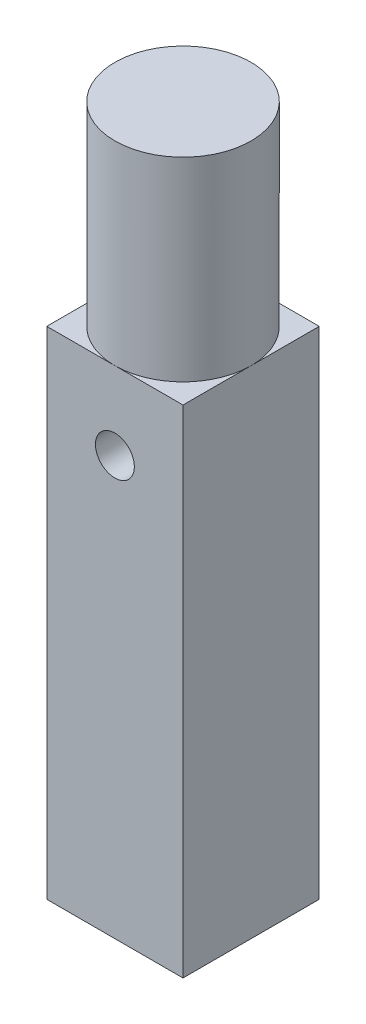
ISO-10303-21;
HEADER;
FILE_DESCRIPTION(('STEP AP214'),'2;1');
FILE_NAME('part.step','',(''),(''),'','','');
FILE_SCHEMA(('AUTOMOTIVE_DESIGN { 1 0 10303 214 1 1 1 1 }'));
ENDSEC;
DATA;
#1=APPLICATION_CONTEXT('core data for automotive mechanical design processes');
#2=APPLICATION_PROTOCOL_DEFINITION('international standard','automotive_design',2000,#1);
#3=PRODUCT_CONTEXT('',#1,'mechanical');
#4=PRODUCT('Part','Part','',(#3));
#5=PRODUCT_RELATED_PRODUCT_CATEGORY('part','',(#4));
#6=PRODUCT_DEFINITION_FORMATION('','',#4);
#7=PRODUCT_DEFINITION_CONTEXT('part definition',#1,'design');
#8=PRODUCT_DEFINITION('design','',#6,#7);
#9=PRODUCT_DEFINITION_SHAPE('','',#8);
#10=(LENGTH_UNIT() NAMED_UNIT(*) SI_UNIT(.MILLI.,.METRE.));
#11=(NAMED_UNIT(*) PLANE_ANGLE_UNIT() SI_UNIT($,.RADIAN.));
#12=(NAMED_UNIT(*) SI_UNIT($,.STERADIAN.) SOLID_ANGLE_UNIT());
#13=UNCERTAINTY_MEASURE_WITH_UNIT(LENGTH_MEASURE(1.E-05),#10,'distance_accuracy_value','');
#14=(GEOMETRIC_REPRESENTATION_CONTEXT(3) GLOBAL_UNCERTAINTY_ASSIGNED_CONTEXT((#13)) GLOBAL_UNIT_ASSIGNED_CONTEXT((#10,
#11,#12)) REPRESENTATION_CONTEXT('',''));
#15=CARTESIAN_POINT('',(0.,0.,0.));
#16=DIRECTION('',(0.,0.,1.));
#17=DIRECTION('',(1.,0.,0.));
#18=AXIS2_PLACEMENT_3D('',#15,#16,#17);
#19=CARTESIAN_POINT('',(0.,450.85,0.));
#20=DIRECTION('',(0.,1.,0.));
#21=DIRECTION('',(0.,0.,1.));
#22=AXIS2_PLACEMENT_3D('',#19,#20,#21);
#23=PLANE('',#22);
#24=CARTESIAN_POINT('',(0.,450.85,0.));
#25=DIRECTION('',(0.,1.,0.));
#26=DIRECTION('',(0.,0.,1.));
#27=AXIS2_PLACEMENT_3D('',#24,#25,#26);
#28=CIRCLE('',#27,44.45);
#29=CARTESIAN_POINT('',(0.,450.85,44.45));
#30=VERTEX_POINT('',#29);
#31=EDGE_CURVE('E187',#30,#30,#28,.T.);
#32=ORIENTED_EDGE('',*,*,#31,.T.);
#33=EDGE_LOOP('',(#32));
#34=FACE_BOUND('',#33,.T.);
#35=ADVANCED_FACE('F71',(#34),#23,.T.);
#36=CARTESIAN_POINT('',(-44.45,450.85,44.45));
#37=DIRECTION('',(0.,0.,-1.));
#38=DIRECTION('',(-1.,0.,0.));
#39=AXIS2_PLACEMENT_3D('',#36,#37,#38);
#40=PLANE('',#39);
#41=CARTESIAN_POINT('',(0.,273.05,44.45));
#42=DIRECTION('',(0.,0.,1.));
#43=DIRECTION('',(1.,0.,0.));
#44=AXIS2_PLACEMENT_3D('',#41,#42,#43);
#45=CIRCLE('',#44,12.7);
#46=CARTESIAN_POINT('',(12.7,273.05,44.45));
#47=VERTEX_POINT('',#46);
#48=EDGE_CURVE('E202',#47,#47,#45,.T.);
#49=ORIENTED_EDGE('',*,*,#48,.F.);
#50=EDGE_LOOP('',(#49));
#51=FACE_BOUND('',#50,.T.);
#52=DIRECTION('',(1.,0.,0.));
#53=VECTOR('',#52,1.);
#54=CARTESIAN_POINT('',(0.,323.85,44.45));
#55=LINE('',#54,#53);
#56=CARTESIAN_POINT('',(0.,323.85,44.45));
#57=VERTEX_POINT('',#56);
#58=CARTESIAN_POINT('',(44.45,323.85,44.45));
#59=VERTEX_POINT('',#58);
#60=EDGE_CURVE('E128',#57,#59,#55,.T.);
#61=ORIENTED_EDGE('',*,*,#60,.F.);
#62=DIRECTION('',(1.,0.,0.));
#63=VECTOR('',#62,1.);
#64=CARTESIAN_POINT('',(0.,323.85,44.45));
#65=LINE('',#64,#63);
#66=CARTESIAN_POINT('',(-44.45,323.85,44.45));
#67=VERTEX_POINT('',#66);
#68=EDGE_CURVE('E138',#67,#57,#65,.T.);
#69=ORIENTED_EDGE('',*,*,#68,.F.);
#70=DIRECTION('',(0.,-1.,0.));
#71=VECTOR('',#70,1.);
#72=CARTESIAN_POINT('',(-44.45,450.85,44.45));
#73=LINE('',#72,#71);
#74=CARTESIAN_POINT('',(-44.45,0.,44.45));
#75=VERTEX_POINT('',#74);
#76=EDGE_CURVE('E93',#67,#75,#73,.T.);
#77=ORIENTED_EDGE('',*,*,#76,.T.);
#78=DIRECTION('',(1.,0.,0.));
#79=VECTOR('',#78,1.);
#80=CARTESIAN_POINT('',(-44.45,0.,44.45));
#81=LINE('',#80,#79);
#82=CARTESIAN_POINT('',(44.45,0.,44.45));
#83=VERTEX_POINT('',#82);
#84=EDGE_CURVE('E161',#75,#83,#81,.T.);
#85=ORIENTED_EDGE('',*,*,#84,.T.);
#86=DIRECTION('',(0.,-1.,0.));
#87=VECTOR('',#86,1.);
#88=CARTESIAN_POINT('',(44.45,450.85,44.45));
#89=LINE('',#88,#87);
#90=EDGE_CURVE('E86',#59,#83,#89,.T.);
#91=ORIENTED_EDGE('',*,*,#90,.F.);
#92=EDGE_LOOP('',(#61,#69,#77,#85,#91));
#93=FACE_BOUND('',#92,.T.);
#94=ADVANCED_FACE('F136',(#51,#93),#40,.F.);
#95=CARTESIAN_POINT('',(44.45,450.85,-44.45));
#96=DIRECTION('',(-1.,0.,0.));
#97=DIRECTION('',(0.,0.,1.));
#98=AXIS2_PLACEMENT_3D('',#95,#96,#97);
#99=PLANE('',#98);
#100=DIRECTION('',(0.,0.,-1.));
#101=VECTOR('',#100,1.);
#102=CARTESIAN_POINT('',(44.45,323.85,0.));
#103=LINE('',#102,#101);
#104=CARTESIAN_POINT('',(44.45,323.85,0.));
#105=VERTEX_POINT('',#104);
#106=EDGE_CURVE('E129',#59,#105,#103,.T.);
#107=ORIENTED_EDGE('',*,*,#106,.F.);
#108=ORIENTED_EDGE('',*,*,#90,.T.);
#109=DIRECTION('',(0.,0.,-1.));
#110=VECTOR('',#109,1.);
#111=CARTESIAN_POINT('',(44.45,0.,-44.45));
#112=LINE('',#111,#110);
#113=CARTESIAN_POINT('',(44.45,0.,-44.45));
#114=VERTEX_POINT('',#113);
#115=EDGE_CURVE('E151',#83,#114,#112,.T.);
#116=ORIENTED_EDGE('',*,*,#115,.T.);
#117=DIRECTION('',(0.,-1.,0.));
#118=VECTOR('',#117,1.);
#119=CARTESIAN_POINT('',(44.45,450.85,-44.45));
#120=LINE('',#119,#118);
#121=CARTESIAN_POINT('',(44.45,323.85,-44.45));
#122=VERTEX_POINT('',#121);
#123=EDGE_CURVE('E12',#122,#114,#120,.T.);
#124=ORIENTED_EDGE('',*,*,#123,.F.);
#125=DIRECTION('',(0.,0.,-1.));
#126=VECTOR('',#125,1.);
#127=CARTESIAN_POINT('',(44.45,323.85,0.));
#128=LINE('',#127,#126);
#129=EDGE_CURVE('E181',#105,#122,#128,.T.);
#130=ORIENTED_EDGE('',*,*,#129,.F.);
#131=EDGE_LOOP('',(#107,#108,#116,#124,#130));
#132=FACE_BOUND('',#131,.T.);
#133=ADVANCED_FACE('F73',(#132),#99,.F.);
#134=CARTESIAN_POINT('',(-44.45,450.85,-44.45));
#135=DIRECTION('',(0.,0.,1.));
#136=DIRECTION('',(1.,0.,0.));
#137=AXIS2_PLACEMENT_3D('',#134,#135,#136);
#138=PLANE('',#137);
#139=CARTESIAN_POINT('',(0.,273.05,-44.45));
#140=DIRECTION('',(0.,0.,1.));
#141=DIRECTION('',(1.,0.,0.));
#142=AXIS2_PLACEMENT_3D('',#139,#140,#141);
#143=CIRCLE('',#142,12.7);
#144=CARTESIAN_POINT('',(12.7,273.05,-44.45));
#145=VERTEX_POINT('',#144);
#146=EDGE_CURVE('E134',#145,#145,#143,.T.);
#147=ORIENTED_EDGE('',*,*,#146,.T.);
#148=EDGE_LOOP('',(#147));
#149=FACE_BOUND('',#148,.T.);
#150=DIRECTION('',(-1.,0.,0.));
#151=VECTOR('',#150,1.);
#152=CARTESIAN_POINT('',(0.,323.85,-44.45));
#153=LINE('',#152,#151);
#154=CARTESIAN_POINT('',(0.,323.85,-44.45));
#155=VERTEX_POINT('',#154);
#156=CARTESIAN_POINT('',(-44.45,323.85,-44.45));
#157=VERTEX_POINT('',#156);
#158=EDGE_CURVE('E194',#155,#157,#153,.T.);
#159=ORIENTED_EDGE('',*,*,#158,.F.);
#160=DIRECTION('',(-1.,0.,0.));
#161=VECTOR('',#160,1.);
#162=CARTESIAN_POINT('',(0.,323.85,-44.45));
#163=LINE('',#162,#161);
#164=EDGE_CURVE('E148',#122,#155,#163,.T.);
#165=ORIENTED_EDGE('',*,*,#164,.F.);
#166=ORIENTED_EDGE('',*,*,#123,.T.);
#167=DIRECTION('',(-1.,0.,0.));
#168=VECTOR('',#167,1.);
#169=CARTESIAN_POINT('',(-44.45,0.,-44.45));
#170=LINE('',#169,#168);
#171=CARTESIAN_POINT('',(-44.45,0.,-44.45));
#172=VERTEX_POINT('',#171);
#173=EDGE_CURVE('E153',#114,#172,#170,.T.);
#174=ORIENTED_EDGE('',*,*,#173,.T.);
#175=DIRECTION('',(0.,-1.,0.));
#176=VECTOR('',#175,1.);
#177=CARTESIAN_POINT('',(-44.45,450.85,-44.45));
#178=LINE('',#177,#176);
#179=EDGE_CURVE('E79',#157,#172,#178,.T.);
#180=ORIENTED_EDGE('',*,*,#179,.F.);
#181=EDGE_LOOP('',(#159,#165,#166,#174,#180));
#182=FACE_BOUND('',#181,.T.);
#183=ADVANCED_FACE('F174',(#149,#182),#138,.F.);
#184=CARTESIAN_POINT('',(-44.45,450.85,-44.45));
#185=DIRECTION('',(1.,0.,0.));
#186=DIRECTION('',(0.,0.,-1.));
#187=AXIS2_PLACEMENT_3D('',#184,#185,#186);
#188=PLANE('',#187);
#189=DIRECTION('',(0.,0.,1.));
#190=VECTOR('',#189,1.);
#191=CARTESIAN_POINT('',(-44.45,323.85,0.));
#192=LINE('',#191,#190);
#193=CARTESIAN_POINT('',(-44.45,323.85,0.));
#194=VERTEX_POINT('',#193);
#195=EDGE_CURVE('E170',#157,#194,#192,.T.);
#196=ORIENTED_EDGE('',*,*,#195,.F.);
#197=ORIENTED_EDGE('',*,*,#179,.T.);
#198=DIRECTION('',(0.,0.,1.));
#199=VECTOR('',#198,1.);
#200=CARTESIAN_POINT('',(-44.45,0.,-44.45));
#201=LINE('',#200,#199);
#202=EDGE_CURVE('E159',#172,#75,#201,.T.);
#203=ORIENTED_EDGE('',*,*,#202,.T.);
#204=ORIENTED_EDGE('',*,*,#76,.F.);
#205=DIRECTION('',(0.,0.,1.));
#206=VECTOR('',#205,1.);
#207=CARTESIAN_POINT('',(-44.45,323.85,0.));
#208=LINE('',#207,#206);
#209=EDGE_CURVE('E147',#194,#67,#208,.T.);
#210=ORIENTED_EDGE('',*,*,#209,.F.);
#211=EDGE_LOOP('',(#196,#197,#203,#204,#210));
#212=FACE_BOUND('',#211,.T.);
#213=ADVANCED_FACE('F167',(#212),#188,.F.);
#214=CARTESIAN_POINT('',(0.,0.,0.));
#215=DIRECTION('',(0.,1.,0.));
#216=DIRECTION('',(0.,0.,1.));
#217=AXIS2_PLACEMENT_3D('',#214,#215,#216);
#218=PLANE('',#217);
#219=ORIENTED_EDGE('',*,*,#115,.F.);
#220=ORIENTED_EDGE('',*,*,#84,.F.);
#221=ORIENTED_EDGE('',*,*,#202,.F.);
#222=ORIENTED_EDGE('',*,*,#173,.F.);
#223=EDGE_LOOP('',(#219,#220,#221,#222));
#224=FACE_BOUND('',#223,.T.);
#225=ADVANCED_FACE('F179',(#224),#218,.F.);
#226=CARTESIAN_POINT('',(0.,323.85,0.));
#227=DIRECTION('',(0.,1.,0.));
#228=DIRECTION('',(0.,0.,1.));
#229=AXIS2_PLACEMENT_3D('',#226,#227,#228);
#230=PLANE('',#229);
#231=CARTESIAN_POINT('',(0.,323.85,0.));
#232=DIRECTION('',(0.,1.,0.));
#233=DIRECTION('',(0.,0.,1.));
#234=AXIS2_PLACEMENT_3D('',#231,#232,#233);
#235=CIRCLE('',#234,44.45);
#236=EDGE_CURVE('E141',#194,#57,#235,.T.);
#237=ORIENTED_EDGE('',*,*,#236,.F.);
#238=ORIENTED_EDGE('',*,*,#209,.T.);
#239=ORIENTED_EDGE('',*,*,#68,.T.);
#240=EDGE_LOOP('',(#237,#238,#239));
#241=FACE_BOUND('',#240,.T.);
#242=ADVANCED_FACE('F150',(#241),#230,.T.);
#243=CARTESIAN_POINT('',(0.,323.85,0.));
#244=DIRECTION('',(0.,1.,0.));
#245=DIRECTION('',(0.,0.,1.));
#246=AXIS2_PLACEMENT_3D('',#243,#244,#245);
#247=CYLINDRICAL_SURFACE('',#246,44.45);
#248=ORIENTED_EDGE('',*,*,#31,.F.);
#249=EDGE_LOOP('',(#248));
#250=FACE_BOUND('',#249,.T.);
#251=CARTESIAN_POINT('',(0.,323.85,0.));
#252=DIRECTION('',(0.,1.,0.));
#253=DIRECTION('',(0.,0.,1.));
#254=AXIS2_PLACEMENT_3D('',#251,#252,#253);
#255=CIRCLE('',#254,44.45);
#256=EDGE_CURVE('E125',#57,#105,#255,.T.);
#257=ORIENTED_EDGE('',*,*,#256,.T.);
#258=CARTESIAN_POINT('',(0.,323.85,0.));
#259=DIRECTION('',(0.,1.,0.));
#260=DIRECTION('',(0.,0.,1.));
#261=AXIS2_PLACEMENT_3D('',#258,#259,#260);
#262=CIRCLE('',#261,44.45);
#263=EDGE_CURVE('E184',#105,#155,#262,.T.);
#264=ORIENTED_EDGE('',*,*,#263,.T.);
#265=CARTESIAN_POINT('',(0.,323.85,0.));
#266=DIRECTION('',(0.,1.,0.));
#267=DIRECTION('',(0.,0.,1.));
#268=AXIS2_PLACEMENT_3D('',#265,#266,#267);
#269=CIRCLE('',#268,44.45);
#270=EDGE_CURVE('E143',#155,#194,#269,.T.);
#271=ORIENTED_EDGE('',*,*,#270,.T.);
#272=ORIENTED_EDGE('',*,*,#236,.T.);
#273=EDGE_LOOP('',(#257,#264,#271,#272));
#274=FACE_BOUND('',#273,.T.);
#275=ADVANCED_FACE('F142',(#250,#274),#247,.T.);
#276=CARTESIAN_POINT('',(0.,323.85,0.));
#277=DIRECTION('',(0.,1.,0.));
#278=DIRECTION('',(0.,0.,1.));
#279=AXIS2_PLACEMENT_3D('',#276,#277,#278);
#280=PLANE('',#279);
#281=ORIENTED_EDGE('',*,*,#263,.F.);
#282=ORIENTED_EDGE('',*,*,#129,.T.);
#283=ORIENTED_EDGE('',*,*,#164,.T.);
#284=EDGE_LOOP('',(#281,#282,#283));
#285=FACE_BOUND('',#284,.T.);
#286=ADVANCED_FACE('F235',(#285),#280,.T.);
#287=CARTESIAN_POINT('',(0.,323.85,0.));
#288=DIRECTION('',(0.,1.,0.));
#289=DIRECTION('',(0.,0.,1.));
#290=AXIS2_PLACEMENT_3D('',#287,#288,#289);
#291=PLANE('',#290);
#292=ORIENTED_EDGE('',*,*,#270,.F.);
#293=ORIENTED_EDGE('',*,*,#158,.T.);
#294=ORIENTED_EDGE('',*,*,#195,.T.);
#295=EDGE_LOOP('',(#292,#293,#294));
#296=FACE_BOUND('',#295,.T.);
#297=ADVANCED_FACE('F230',(#296),#291,.T.);
#298=CARTESIAN_POINT('',(0.,323.85,0.));
#299=DIRECTION('',(0.,1.,0.));
#300=DIRECTION('',(0.,0.,1.));
#301=AXIS2_PLACEMENT_3D('',#298,#299,#300);
#302=PLANE('',#301);
#303=ORIENTED_EDGE('',*,*,#256,.F.);
#304=ORIENTED_EDGE('',*,*,#60,.T.);
#305=ORIENTED_EDGE('',*,*,#106,.T.);
#306=EDGE_LOOP('',(#303,#304,#305));
#307=FACE_BOUND('',#306,.T.);
#308=ADVANCED_FACE('F127',(#307),#302,.T.);
#309=CARTESIAN_POINT('',(0.,273.05,-44.45));
#310=DIRECTION('',(0.,0.,1.));
#311=DIRECTION('',(1.,0.,0.));
#312=AXIS2_PLACEMENT_3D('',#309,#310,#311);
#313=CYLINDRICAL_SURFACE('',#312,12.7);
#314=ORIENTED_EDGE('',*,*,#146,.F.);
#315=EDGE_LOOP('',(#314));
#316=FACE_BOUND('',#315,.T.);
#317=ORIENTED_EDGE('',*,*,#48,.T.);
#318=EDGE_LOOP('',(#317));
#319=FACE_BOUND('',#318,.T.);
#320=ADVANCED_FACE('F206',(#316,#319),#313,.F.);
#321=CLOSED_SHELL('',(#35,#94,#133,#183,#213,#225,#242,#275,#286,#297,#308,#320));
#322=MANIFOLD_SOLID_BREP('B2',#321);
#323=ADVANCED_BREP_SHAPE_REPRESENTATION('',(#18,#322),#14);
#324=SHAPE_DEFINITION_REPRESENTATION(#9,#323);
ENDSEC;
END-ISO-10303-21;
